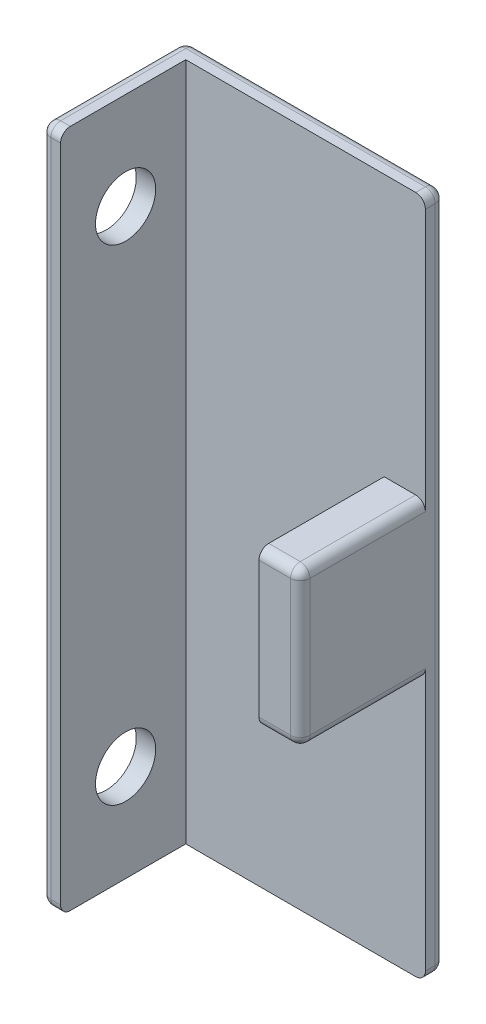
ISO-10303-21;
HEADER;
FILE_DESCRIPTION(('STEP AP214'),'2;1');
FILE_NAME('part.step','',(''),(''),'','','');
FILE_SCHEMA(('AUTOMOTIVE_DESIGN { 1 0 10303 214 1 1 1 1 }'));
ENDSEC;
DATA;
#1=APPLICATION_CONTEXT('core data for automotive mechanical design processes');
#2=APPLICATION_PROTOCOL_DEFINITION('international standard','automotive_design',2000,#1);
#3=PRODUCT_CONTEXT('',#1,'mechanical');
#4=PRODUCT('Part','Part','',(#3));
#5=PRODUCT_RELATED_PRODUCT_CATEGORY('part','',(#4));
#6=PRODUCT_DEFINITION_FORMATION('','',#4);
#7=PRODUCT_DEFINITION_CONTEXT('part definition',#1,'design');
#8=PRODUCT_DEFINITION('design','',#6,#7);
#9=PRODUCT_DEFINITION_SHAPE('','',#8);
#10=(LENGTH_UNIT() NAMED_UNIT(*) SI_UNIT(.MILLI.,.METRE.));
#11=(NAMED_UNIT(*) PLANE_ANGLE_UNIT() SI_UNIT($,.RADIAN.));
#12=(NAMED_UNIT(*) SI_UNIT($,.STERADIAN.) SOLID_ANGLE_UNIT());
#13=UNCERTAINTY_MEASURE_WITH_UNIT(LENGTH_MEASURE(1.E-05),#10,'distance_accuracy_value','');
#14=(GEOMETRIC_REPRESENTATION_CONTEXT(3) GLOBAL_UNCERTAINTY_ASSIGNED_CONTEXT((#13)) GLOBAL_UNIT_ASSIGNED_CONTEXT((#10,
#11,#12)) REPRESENTATION_CONTEXT('',''));
#15=CARTESIAN_POINT('',(0.,0.,0.));
#16=DIRECTION('',(0.,0.,1.));
#17=DIRECTION('',(1.,0.,0.));
#18=AXIS2_PLACEMENT_3D('',#15,#16,#17);
#19=CARTESIAN_POINT('',(0.,0.,2.));
#20=DIRECTION('',(0.,0.,-1.));
#21=DIRECTION('',(-1.,0.,0.));
#22=AXIS2_PLACEMENT_3D('',#19,#20,#21);
#23=PLANE('',#22);
#24=DIRECTION('',(0.,-1.,0.));
#25=VECTOR('',#24,1.);
#26=CARTESIAN_POINT('',(26.7,0.,2.));
#27=LINE('',#26,#25);
#28=CARTESIAN_POINT('',(26.7,28.,2.));
#29=VERTEX_POINT('',#28);
#30=CARTESIAN_POINT('',(26.7,1.,2.));
#31=VERTEX_POINT('',#30);
#32=EDGE_CURVE('E193',#29,#31,#27,.T.);
#33=ORIENTED_EDGE('',*,*,#32,.F.);
#34=CARTESIAN_POINT('',(25.7,28.,2.));
#35=DIRECTION('',(0.,0.,-1.));
#36=DIRECTION('',(-1.,0.,0.));
#37=AXIS2_PLACEMENT_3D('',#34,#35,#36);
#38=CIRCLE('',#37,1.);
#39=CARTESIAN_POINT('',(25.7,27.,2.));
#40=VERTEX_POINT('',#39);
#41=EDGE_CURVE('E189',#29,#40,#38,.T.);
#42=ORIENTED_EDGE('',*,*,#41,.T.);
#43=DIRECTION('',(-1.,0.,0.));
#44=VECTOR('',#43,1.);
#45=CARTESIAN_POINT('',(56.6234022129837,27.,2.));
#46=LINE('',#45,#44);
#47=CARTESIAN_POINT('',(22.45,27.,2.));
#48=VERTEX_POINT('',#47);
#49=EDGE_CURVE('E183',#40,#48,#46,.T.);
#50=ORIENTED_EDGE('',*,*,#49,.T.);
#51=DIRECTION('',(0.,-1.,0.));
#52=VECTOR('',#51,1.);
#53=CARTESIAN_POINT('',(22.45,43.,2.));
#54=LINE('',#53,#52);
#55=CARTESIAN_POINT('',(22.45,43.,2.));
#56=VERTEX_POINT('',#55);
#57=EDGE_CURVE('E187',#56,#48,#54,.T.);
#58=ORIENTED_EDGE('',*,*,#57,.F.);
#59=DIRECTION('',(-1.,0.,0.));
#60=VECTOR('',#59,1.);
#61=CARTESIAN_POINT('',(56.6234022129837,43.,2.));
#62=LINE('',#61,#60);
#63=CARTESIAN_POINT('',(25.7,43.,2.));
#64=VERTEX_POINT('',#63);
#65=EDGE_CURVE('E192',#64,#56,#62,.T.);
#66=ORIENTED_EDGE('',*,*,#65,.F.);
#67=CARTESIAN_POINT('',(25.7,42.,2.));
#68=DIRECTION('',(0.,0.,-1.));
#69=DIRECTION('',(-1.,0.,0.));
#70=AXIS2_PLACEMENT_3D('',#67,#68,#69);
#71=CIRCLE('',#70,1.);
#72=CARTESIAN_POINT('',(26.7,42.,2.));
#73=VERTEX_POINT('',#72);
#74=EDGE_CURVE('E11',#64,#73,#71,.T.);
#75=ORIENTED_EDGE('',*,*,#74,.T.);
#76=DIRECTION('',(0.,1.,0.));
#77=VECTOR('',#76,1.);
#78=CARTESIAN_POINT('',(26.7,70.,2.));
#79=LINE('',#78,#77);
#80=CARTESIAN_POINT('',(26.7,69.,2.));
#81=VERTEX_POINT('',#80);
#82=EDGE_CURVE('E52',#73,#81,#79,.T.);
#83=ORIENTED_EDGE('',*,*,#82,.T.);
#84=CARTESIAN_POINT('',(25.7,69.,2.));
#85=DIRECTION('',(0.,0.,-1.));
#86=DIRECTION('',(0.,1.,0.));
#87=AXIS2_PLACEMENT_3D('',#84,#85,#86);
#88=CIRCLE('',#87,1.);
#89=CARTESIAN_POINT('',(25.7,70.,2.));
#90=VERTEX_POINT('',#89);
#91=EDGE_CURVE('E224',#81,#90,#88,.F.);
#92=ORIENTED_EDGE('',*,*,#91,.T.);
#93=DIRECTION('',(-1.,0.,0.));
#94=VECTOR('',#93,1.);
#95=CARTESIAN_POINT('',(0.,70.,2.));
#96=LINE('',#95,#94);
#97=CARTESIAN_POINT('',(2.,70.,2.));
#98=VERTEX_POINT('',#97);
#99=EDGE_CURVE('E251',#90,#98,#96,.T.);
#100=ORIENTED_EDGE('',*,*,#99,.T.);
#101=DIRECTION('',(0.,1.,0.));
#102=VECTOR('',#101,1.);
#103=CARTESIAN_POINT('',(2.,70.,2.));
#104=LINE('',#103,#102);
#105=CARTESIAN_POINT('',(2.,0.,2.));
#106=VERTEX_POINT('',#105);
#107=EDGE_CURVE('E239',#106,#98,#104,.T.);
#108=ORIENTED_EDGE('',*,*,#107,.F.);
#109=DIRECTION('',(1.,0.,0.));
#110=VECTOR('',#109,1.);
#111=CARTESIAN_POINT('',(0.,0.,2.));
#112=LINE('',#111,#110);
#113=CARTESIAN_POINT('',(25.7,0.,2.));
#114=VERTEX_POINT('',#113);
#115=EDGE_CURVE('E249',#106,#114,#112,.T.);
#116=ORIENTED_EDGE('',*,*,#115,.T.);
#117=CARTESIAN_POINT('',(25.7,1.,2.));
#118=DIRECTION('',(0.,0.,1.));
#119=DIRECTION('',(1.,0.,0.));
#120=AXIS2_PLACEMENT_3D('',#117,#118,#119);
#121=CIRCLE('',#120,1.);
#122=EDGE_CURVE('E218',#31,#114,#121,.F.);
#123=ORIENTED_EDGE('',*,*,#122,.F.);
#124=EDGE_LOOP('',(#33,#42,#50,#58,#66,#75,#83,#92,#100,#108,#116,#123));
#125=FACE_BOUND('',#124,.T.);
#126=ADVANCED_FACE('F35',(#125),#23,.F.);
#127=CARTESIAN_POINT('',(25.7,0.,13.9));
#128=DIRECTION('',(0.,-1.,0.));
#129=DIRECTION('',(0.,0.,-1.));
#130=AXIS2_PLACEMENT_3D('',#127,#128,#129);
#131=CYLINDRICAL_SURFACE('',#130,1.);
#132=DIRECTION('',(0.,-1.,0.));
#133=VECTOR('',#132,1.);
#134=CARTESIAN_POINT('',(26.7,0.,13.9));
#135=LINE('',#134,#133);
#136=CARTESIAN_POINT('',(26.7,42.,13.9));
#137=VERTEX_POINT('',#136);
#138=CARTESIAN_POINT('',(26.7,28.,13.9));
#139=VERTEX_POINT('',#138);
#140=EDGE_CURVE('E367',#137,#139,#135,.T.);
#141=ORIENTED_EDGE('',*,*,#140,.F.);
#142=CARTESIAN_POINT('',(25.7,42.,13.9));
#143=DIRECTION('',(0.,-1.,0.));
#144=DIRECTION('',(0.,0.,-1.));
#145=AXIS2_PLACEMENT_3D('',#142,#143,#144);
#146=CIRCLE('',#145,1.);
#147=CARTESIAN_POINT('',(25.7,42.,14.9));
#148=VERTEX_POINT('',#147);
#149=EDGE_CURVE('E394',#137,#148,#146,.T.);
#150=ORIENTED_EDGE('',*,*,#149,.T.);
#151=DIRECTION('',(0.,-1.,0.));
#152=VECTOR('',#151,1.);
#153=CARTESIAN_POINT('',(25.7,0.,14.9));
#154=LINE('',#153,#152);
#155=CARTESIAN_POINT('',(25.7,28.,14.9));
#156=VERTEX_POINT('',#155);
#157=EDGE_CURVE('E364',#156,#148,#154,.F.);
#158=ORIENTED_EDGE('',*,*,#157,.F.);
#159=CARTESIAN_POINT('',(25.7,28.,13.9));
#160=DIRECTION('',(0.,-1.,0.));
#161=DIRECTION('',(0.,0.,-1.));
#162=AXIS2_PLACEMENT_3D('',#159,#160,#161);
#163=CIRCLE('',#162,1.);
#164=EDGE_CURVE('E376',#156,#139,#163,.F.);
#165=ORIENTED_EDGE('',*,*,#164,.T.);
#166=EDGE_LOOP('',(#141,#150,#158,#165));
#167=FACE_BOUND('',#166,.T.);
#168=ADVANCED_FACE('F497',(#167),#131,.T.);
#169=CARTESIAN_POINT('',(25.7,1.,2.));
#170=DIRECTION('',(0.,0.,1.));
#171=DIRECTION('',(1.,0.,0.));
#172=AXIS2_PLACEMENT_3D('',#169,#170,#171);
#173=CYLINDRICAL_SURFACE('',#172,1.);
#174=DIRECTION('',(0.,0.,1.));
#175=VECTOR('',#174,1.);
#176=CARTESIAN_POINT('',(26.7,1.,2.));
#177=LINE('',#176,#175);
#178=CARTESIAN_POINT('',(26.7,1.,1.));
#179=VERTEX_POINT('',#178);
#180=EDGE_CURVE('E316',#31,#179,#177,.F.);
#181=ORIENTED_EDGE('',*,*,#180,.F.);
#182=ORIENTED_EDGE('',*,*,#122,.T.);
#183=DIRECTION('',(0.,0.,1.));
#184=VECTOR('',#183,1.);
#185=CARTESIAN_POINT('',(25.7,0.,2.));
#186=LINE('',#185,#184);
#187=CARTESIAN_POINT('',(25.7,0.,1.));
#188=VERTEX_POINT('',#187);
#189=EDGE_CURVE('E296',#188,#114,#186,.T.);
#190=ORIENTED_EDGE('',*,*,#189,.F.);
#191=CARTESIAN_POINT('',(25.7,1.,1.));
#192=DIRECTION('',(0.,0.,1.));
#193=DIRECTION('',(1.,0.,0.));
#194=AXIS2_PLACEMENT_3D('',#191,#192,#193);
#195=CIRCLE('',#194,1.);
#196=EDGE_CURVE('E324',#188,#179,#195,.T.);
#197=ORIENTED_EDGE('',*,*,#196,.T.);
#198=EDGE_LOOP('',(#181,#182,#190,#197));
#199=FACE_BOUND('',#198,.T.);
#200=ADVANCED_FACE('F501',(#199),#173,.T.);
#201=CARTESIAN_POINT('',(0.,0.,2.));
#202=DIRECTION('',(0.,1.,0.));
#203=DIRECTION('',(0.,0.,1.));
#204=AXIS2_PLACEMENT_3D('',#201,#202,#203);
#205=PLANE('',#204);
#206=ORIENTED_EDGE('',*,*,#189,.T.);
#207=ORIENTED_EDGE('',*,*,#115,.F.);
#208=DIRECTION('',(0.,0.,-1.));
#209=VECTOR('',#208,1.);
#210=CARTESIAN_POINT('',(2.00000000000001,0.,14.9));
#211=LINE('',#210,#209);
#212=CARTESIAN_POINT('',(2.00000000000001,0.,13.9));
#213=VERTEX_POINT('',#212);
#214=EDGE_CURVE('E247',#213,#106,#211,.T.);
#215=ORIENTED_EDGE('',*,*,#214,.F.);
#216=DIRECTION('',(-1.,0.,0.));
#217=VECTOR('',#216,1.);
#218=CARTESIAN_POINT('',(0.,0.,13.9));
#219=LINE('',#218,#217);
#220=CARTESIAN_POINT('',(1.,0.,13.9));
#221=VERTEX_POINT('',#220);
#222=EDGE_CURVE('E327',#213,#221,#219,.T.);
#223=ORIENTED_EDGE('',*,*,#222,.T.);
#224=DIRECTION('',(0.,0.,-1.));
#225=VECTOR('',#224,1.);
#226=CARTESIAN_POINT('',(1.,0.,2.));
#227=LINE('',#226,#225);
#228=CARTESIAN_POINT('',(1.,0.,1.));
#229=VERTEX_POINT('',#228);
#230=EDGE_CURVE('E302',#221,#229,#227,.T.);
#231=ORIENTED_EDGE('',*,*,#230,.T.);
#232=DIRECTION('',(1.,0.,0.));
#233=VECTOR('',#232,1.);
#234=CARTESIAN_POINT('',(0.,0.,1.));
#235=LINE('',#234,#233);
#236=EDGE_CURVE('E299',#229,#188,#235,.T.);
#237=ORIENTED_EDGE('',*,*,#236,.T.);
#238=EDGE_LOOP('',(#206,#207,#215,#223,#231,#237));
#239=FACE_BOUND('',#238,.T.);
#240=ADVANCED_FACE('F465',(#239),#205,.F.);
#241=CARTESIAN_POINT('',(26.7,0.,2.));
#242=DIRECTION('',(-1.,0.,0.));
#243=DIRECTION('',(0.,0.,1.));
#244=AXIS2_PLACEMENT_3D('',#241,#242,#243);
#245=PLANE('',#244);
#246=ORIENTED_EDGE('',*,*,#82,.F.);
#247=DIRECTION('',(0.,0.,-1.));
#248=VECTOR('',#247,1.);
#249=CARTESIAN_POINT('',(26.7,42.,2.));
#250=LINE('',#249,#248);
#251=EDGE_CURVE('E44',#73,#137,#250,.F.);
#252=ORIENTED_EDGE('',*,*,#251,.T.);
#253=ORIENTED_EDGE('',*,*,#140,.T.);
#254=DIRECTION('',(0.,0.,-1.));
#255=VECTOR('',#254,1.);
#256=CARTESIAN_POINT('',(26.7,28.,2.));
#257=LINE('',#256,#255);
#258=EDGE_CURVE('E379',#139,#29,#257,.T.);
#259=ORIENTED_EDGE('',*,*,#258,.T.);
#260=ORIENTED_EDGE('',*,*,#32,.T.);
#261=ORIENTED_EDGE('',*,*,#180,.T.);
#262=DIRECTION('',(0.,-1.,0.));
#263=VECTOR('',#262,1.);
#264=CARTESIAN_POINT('',(26.7,0.,1.));
#265=LINE('',#264,#263);
#266=CARTESIAN_POINT('',(26.7,69.,1.));
#267=VERTEX_POINT('',#266);
#268=EDGE_CURVE('E280',#179,#267,#265,.F.);
#269=ORIENTED_EDGE('',*,*,#268,.T.);
#270=DIRECTION('',(0.,0.,-1.));
#271=VECTOR('',#270,1.);
#272=CARTESIAN_POINT('',(26.7,69.,2.));
#273=LINE('',#272,#271);
#274=EDGE_CURVE('E282',#267,#81,#273,.F.);
#275=ORIENTED_EDGE('',*,*,#274,.T.);
#276=EDGE_LOOP('',(#246,#252,#253,#259,#260,#261,#269,#275));
#277=FACE_BOUND('',#276,.T.);
#278=ADVANCED_FACE('F418',(#277),#245,.F.);
#279=CARTESIAN_POINT('',(0.,0.,14.9));
#280=DIRECTION('',(0.,0.,-1.));
#281=DIRECTION('',(-1.,0.,0.));
#282=AXIS2_PLACEMENT_3D('',#279,#280,#281);
#283=PLANE('',#282);
#284=ORIENTED_EDGE('',*,*,#157,.T.);
#285=DIRECTION('',(-1.,0.,0.));
#286=VECTOR('',#285,1.);
#287=CARTESIAN_POINT('',(0.,42.,14.9));
#288=LINE('',#287,#286);
#289=CARTESIAN_POINT('',(22.45,42.,14.9));
#290=VERTEX_POINT('',#289);
#291=EDGE_CURVE('E383',#148,#290,#288,.T.);
#292=ORIENTED_EDGE('',*,*,#291,.T.);
#293=DIRECTION('',(0.,1.,0.));
#294=VECTOR('',#293,1.);
#295=CARTESIAN_POINT('',(22.45,43.,14.9));
#296=LINE('',#295,#294);
#297=CARTESIAN_POINT('',(22.45,28.,14.9));
#298=VERTEX_POINT('',#297);
#299=EDGE_CURVE('E202',#298,#290,#296,.T.);
#300=ORIENTED_EDGE('',*,*,#299,.F.);
#301=DIRECTION('',(-1.,0.,0.));
#302=VECTOR('',#301,1.);
#303=CARTESIAN_POINT('',(25.7,28.,14.9));
#304=LINE('',#303,#302);
#305=EDGE_CURVE('E374',#298,#156,#304,.F.);
#306=ORIENTED_EDGE('',*,*,#305,.T.);
#307=EDGE_LOOP('',(#284,#292,#300,#306));
#308=FACE_BOUND('',#307,.T.);
#309=ADVANCED_FACE('F509',(#308),#283,.F.);
#310=CARTESIAN_POINT('',(1.,69.,13.9));
#311=DIRECTION('',(0.,0.,1.));
#312=DIRECTION('',(1.,0.,0.));
#313=AXIS2_PLACEMENT_3D('',#310,#311,#312);
#314=SPHERICAL_SURFACE('',#313,1.);
#315=CARTESIAN_POINT('',(1.,69.,13.9));
#316=DIRECTION('',(1.,0.,0.));
#317=DIRECTION('',(0.,0.,-1.));
#318=AXIS2_PLACEMENT_3D('',#315,#316,#317);
#319=CIRCLE('',#318,1.);
#320=CARTESIAN_POINT('',(1.,70.,13.9));
#321=VERTEX_POINT('',#320);
#322=CARTESIAN_POINT('',(1.,69.,14.9));
#323=VERTEX_POINT('',#322);
#324=EDGE_CURVE('E362',#321,#323,#319,.T.);
#325=ORIENTED_EDGE('',*,*,#324,.F.);
#326=CARTESIAN_POINT('',(1.,69.,13.9));
#327=DIRECTION('',(0.,0.,1.));
#328=DIRECTION('',(1.,0.,0.));
#329=AXIS2_PLACEMENT_3D('',#326,#327,#328);
#330=CIRCLE('',#329,1.);
#331=CARTESIAN_POINT('',(0.,69.,13.9));
#332=VERTEX_POINT('',#331);
#333=EDGE_CURVE('E349',#332,#321,#330,.F.);
#334=ORIENTED_EDGE('',*,*,#333,.F.);
#335=CARTESIAN_POINT('',(1.,69.,13.9));
#336=DIRECTION('',(0.,1.,0.));
#337=DIRECTION('',(0.,0.,1.));
#338=AXIS2_PLACEMENT_3D('',#335,#336,#337);
#339=CIRCLE('',#338,1.);
#340=EDGE_CURVE('E359',#332,#323,#339,.T.);
#341=ORIENTED_EDGE('',*,*,#340,.T.);
#342=EDGE_LOOP('',(#325,#334,#341));
#343=FACE_BOUND('',#342,.T.);
#344=ADVANCED_FACE('F445',(#343),#314,.T.);
#345=CARTESIAN_POINT('',(1.,0.,13.9));
#346=DIRECTION('',(0.,-1.,0.));
#347=DIRECTION('',(0.,0.,-1.));
#348=AXIS2_PLACEMENT_3D('',#345,#346,#347);
#349=CYLINDRICAL_SURFACE('',#348,1.);
#350=ORIENTED_EDGE('',*,*,#340,.F.);
#351=DIRECTION('',(0.,1.,0.));
#352=VECTOR('',#351,1.);
#353=CARTESIAN_POINT('',(0.,0.,13.9));
#354=LINE('',#353,#352);
#355=CARTESIAN_POINT('',(0.,1.,13.9));
#356=VERTEX_POINT('',#355);
#357=EDGE_CURVE('E346',#356,#332,#354,.T.);
#358=ORIENTED_EDGE('',*,*,#357,.F.);
#359=CARTESIAN_POINT('',(1.,1.,13.9));
#360=DIRECTION('',(0.,1.,0.));
#361=DIRECTION('',(0.,0.,1.));
#362=AXIS2_PLACEMENT_3D('',#359,#360,#361);
#363=CIRCLE('',#362,1.);
#364=CARTESIAN_POINT('',(1.,1.,14.9));
#365=VERTEX_POINT('',#364);
#366=EDGE_CURVE('E357',#356,#365,#363,.T.);
#367=ORIENTED_EDGE('',*,*,#366,.T.);
#368=DIRECTION('',(0.,1.,0.));
#369=VECTOR('',#368,1.);
#370=CARTESIAN_POINT('',(1.,0.,14.9));
#371=LINE('',#370,#369);
#372=EDGE_CURVE('E333',#323,#365,#371,.F.);
#373=ORIENTED_EDGE('',*,*,#372,.F.);
#374=EDGE_LOOP('',(#350,#358,#367,#373));
#375=FACE_BOUND('',#374,.T.);
#376=ADVANCED_FACE('F453',(#375),#349,.T.);
#377=CARTESIAN_POINT('',(1.,1.,13.9));
#378=DIRECTION('',(0.,0.,1.));
#379=DIRECTION('',(1.,0.,0.));
#380=AXIS2_PLACEMENT_3D('',#377,#378,#379);
#381=SPHERICAL_SURFACE('',#380,1.);
#382=ORIENTED_EDGE('',*,*,#366,.F.);
#383=CARTESIAN_POINT('',(1.,1.,13.9));
#384=DIRECTION('',(0.,0.,-1.));
#385=DIRECTION('',(-1.,0.,0.));
#386=AXIS2_PLACEMENT_3D('',#383,#384,#385);
#387=CIRCLE('',#386,1.);
#388=EDGE_CURVE('E343',#221,#356,#387,.T.);
#389=ORIENTED_EDGE('',*,*,#388,.F.);
#390=CARTESIAN_POINT('',(1.,1.,13.9));
#391=DIRECTION('',(-1.,0.,0.));
#392=DIRECTION('',(0.,0.,1.));
#393=AXIS2_PLACEMENT_3D('',#390,#391,#392);
#394=CIRCLE('',#393,1.);
#395=EDGE_CURVE('E354',#221,#365,#394,.T.);
#396=ORIENTED_EDGE('',*,*,#395,.T.);
#397=EDGE_LOOP('',(#382,#389,#396));
#398=FACE_BOUND('',#397,.T.);
#399=ADVANCED_FACE('F460',(#398),#381,.T.);
#400=CARTESIAN_POINT('',(0.,1.,13.9));
#401=DIRECTION('',(1.,0.,0.));
#402=DIRECTION('',(0.,0.,-1.));
#403=AXIS2_PLACEMENT_3D('',#400,#401,#402);
#404=CYLINDRICAL_SURFACE('',#403,1.);
#405=ORIENTED_EDGE('',*,*,#395,.F.);
#406=ORIENTED_EDGE('',*,*,#222,.F.);
#407=CARTESIAN_POINT('',(2.00000000000001,1.,13.9));
#408=DIRECTION('',(-1.,0.,0.));
#409=DIRECTION('',(0.,-1.,0.));
#410=AXIS2_PLACEMENT_3D('',#407,#408,#409);
#411=CIRCLE('',#410,1.);
#412=CARTESIAN_POINT('',(2.00000000000001,1.,14.9));
#413=VERTEX_POINT('',#412);
#414=EDGE_CURVE('E341',#413,#213,#411,.F.);
#415=ORIENTED_EDGE('',*,*,#414,.F.);
#416=DIRECTION('',(-1.,0.,0.));
#417=VECTOR('',#416,1.);
#418=CARTESIAN_POINT('',(0.,1.,14.9));
#419=LINE('',#418,#417);
#420=EDGE_CURVE('E336',#365,#413,#419,.F.);
#421=ORIENTED_EDGE('',*,*,#420,.F.);
#422=EDGE_LOOP('',(#405,#406,#415,#421));
#423=FACE_BOUND('',#422,.T.);
#424=ADVANCED_FACE('F469',(#423),#404,.T.);
#425=CARTESIAN_POINT('',(0.,69.,13.9));
#426=DIRECTION('',(-1.,0.,0.));
#427=DIRECTION('',(0.,0.,1.));
#428=AXIS2_PLACEMENT_3D('',#425,#426,#427);
#429=CYLINDRICAL_SURFACE('',#428,1.);
#430=DIRECTION('',(1.,0.,0.));
#431=VECTOR('',#430,1.);
#432=CARTESIAN_POINT('',(0.,70.,13.9));
#433=LINE('',#432,#431);
#434=CARTESIAN_POINT('',(2.,70.,13.9));
#435=VERTEX_POINT('',#434);
#436=EDGE_CURVE('E352',#321,#435,#433,.T.);
#437=ORIENTED_EDGE('',*,*,#436,.F.);
#438=ORIENTED_EDGE('',*,*,#324,.T.);
#439=DIRECTION('',(1.,0.,0.));
#440=VECTOR('',#439,1.);
#441=CARTESIAN_POINT('',(0.,69.,14.9));
#442=LINE('',#441,#440);
#443=CARTESIAN_POINT('',(2.,69.,14.9));
#444=VERTEX_POINT('',#443);
#445=EDGE_CURVE('E330',#444,#323,#442,.F.);
#446=ORIENTED_EDGE('',*,*,#445,.F.);
#447=CARTESIAN_POINT('',(2.,69.,13.9));
#448=DIRECTION('',(-1.,0.,0.));
#449=DIRECTION('',(0.,-1.,0.));
#450=AXIS2_PLACEMENT_3D('',#447,#448,#449);
#451=CIRCLE('',#450,1.);
#452=EDGE_CURVE('E339',#435,#444,#451,.F.);
#453=ORIENTED_EDGE('',*,*,#452,.F.);
#454=EDGE_LOOP('',(#437,#438,#446,#453));
#455=FACE_BOUND('',#454,.T.);
#456=ADVANCED_FACE('F476',(#455),#429,.T.);
#457=CARTESIAN_POINT('',(25.7,1.,1.));
#458=DIRECTION('',(0.,1.,0.));
#459=DIRECTION('',(0.,0.,1.));
#460=AXIS2_PLACEMENT_3D('',#457,#458,#459);
#461=SPHERICAL_SURFACE('',#460,1.);
#462=ORIENTED_EDGE('',*,*,#196,.F.);
#463=CARTESIAN_POINT('',(25.7,1.,1.));
#464=DIRECTION('',(1.,0.,0.));
#465=DIRECTION('',(0.,0.,-1.));
#466=AXIS2_PLACEMENT_3D('',#463,#464,#465);
#467=CIRCLE('',#466,1.);
#468=CARTESIAN_POINT('',(25.7,1.,0.));
#469=VERTEX_POINT('',#468);
#470=EDGE_CURVE('E322',#188,#469,#467,.T.);
#471=ORIENTED_EDGE('',*,*,#470,.T.);
#472=CARTESIAN_POINT('',(25.7,1.,1.));
#473=DIRECTION('',(0.,1.,0.));
#474=DIRECTION('',(0.,0.,1.));
#475=AXIS2_PLACEMENT_3D('',#472,#473,#474);
#476=CIRCLE('',#475,1.);
#477=EDGE_CURVE('E313',#179,#469,#476,.T.);
#478=ORIENTED_EDGE('',*,*,#477,.F.);
#479=EDGE_LOOP('',(#462,#471,#478));
#480=FACE_BOUND('',#479,.T.);
#481=ADVANCED_FACE('F540',(#480),#461,.T.);
#482=CARTESIAN_POINT('',(0.,1.,1.));
#483=DIRECTION('',(-1.,0.,0.));
#484=DIRECTION('',(0.,0.,1.));
#485=AXIS2_PLACEMENT_3D('',#482,#483,#484);
#486=CYLINDRICAL_SURFACE('',#485,1.);
#487=ORIENTED_EDGE('',*,*,#470,.F.);
#488=ORIENTED_EDGE('',*,*,#236,.F.);
#489=CARTESIAN_POINT('',(1.,1.,1.));
#490=DIRECTION('',(1.,0.,0.));
#491=DIRECTION('',(0.,0.,-1.));
#492=AXIS2_PLACEMENT_3D('',#489,#490,#491);
#493=CIRCLE('',#492,1.);
#494=CARTESIAN_POINT('',(1.,1.,0.));
#495=VERTEX_POINT('',#494);
#496=EDGE_CURVE('E320',#229,#495,#493,.T.);
#497=ORIENTED_EDGE('',*,*,#496,.T.);
#498=DIRECTION('',(1.,0.,0.));
#499=VECTOR('',#498,1.);
#500=CARTESIAN_POINT('',(0.,1.,0.));
#501=LINE('',#500,#499);
#502=EDGE_CURVE('E310',#469,#495,#501,.F.);
#503=ORIENTED_EDGE('',*,*,#502,.F.);
#504=EDGE_LOOP('',(#487,#488,#497,#503));
#505=FACE_BOUND('',#504,.T.);
#506=ADVANCED_FACE('F536',(#505),#486,.T.);
#507=CARTESIAN_POINT('',(1.,1.,1.));
#508=DIRECTION('',(0.,1.,0.));
#509=DIRECTION('',(0.,0.,1.));
#510=AXIS2_PLACEMENT_3D('',#507,#508,#509);
#511=SPHERICAL_SURFACE('',#510,1.);
#512=ORIENTED_EDGE('',*,*,#496,.F.);
#513=CARTESIAN_POINT('',(1.,1.,1.));
#514=DIRECTION('',(0.,0.,-1.));
#515=DIRECTION('',(-1.,0.,0.));
#516=AXIS2_PLACEMENT_3D('',#513,#514,#515);
#517=CIRCLE('',#516,1.);
#518=CARTESIAN_POINT('',(0.,1.,1.));
#519=VERTEX_POINT('',#518);
#520=EDGE_CURVE('E318',#229,#519,#517,.T.);
#521=ORIENTED_EDGE('',*,*,#520,.T.);
#522=CARTESIAN_POINT('',(1.,1.,1.));
#523=DIRECTION('',(0.,-1.,0.));
#524=DIRECTION('',(0.,0.,-1.));
#525=AXIS2_PLACEMENT_3D('',#522,#523,#524);
#526=CIRCLE('',#525,1.);
#527=EDGE_CURVE('E307',#495,#519,#526,.F.);
#528=ORIENTED_EDGE('',*,*,#527,.F.);
#529=EDGE_LOOP('',(#512,#521,#528));
#530=FACE_BOUND('',#529,.T.);
#531=ADVANCED_FACE('F533',(#530),#511,.T.);
#532=CARTESIAN_POINT('',(1.,1.,2.));
#533=DIRECTION('',(0.,0.,-1.));
#534=DIRECTION('',(-1.,0.,0.));
#535=AXIS2_PLACEMENT_3D('',#532,#533,#534);
#536=CYLINDRICAL_SURFACE('',#535,1.);
#537=ORIENTED_EDGE('',*,*,#230,.F.);
#538=ORIENTED_EDGE('',*,*,#388,.T.);
#539=DIRECTION('',(0.,0.,-1.));
#540=VECTOR('',#539,1.);
#541=CARTESIAN_POINT('',(0.,1.,2.));
#542=LINE('',#541,#540);
#543=EDGE_CURVE('E304',#519,#356,#542,.F.);
#544=ORIENTED_EDGE('',*,*,#543,.F.);
#545=ORIENTED_EDGE('',*,*,#520,.F.);
#546=EDGE_LOOP('',(#537,#538,#544,#545));
#547=FACE_BOUND('',#546,.T.);
#548=ADVANCED_FACE('F457',(#547),#536,.T.);
#549=CARTESIAN_POINT('',(25.7,69.,1.));
#550=DIRECTION('',(-1.,0.,0.));
#551=DIRECTION('',(0.,0.,1.));
#552=AXIS2_PLACEMENT_3D('',#549,#550,#551);
#553=SPHERICAL_SURFACE('',#552,1.);
#554=CARTESIAN_POINT('',(25.7,69.,1.));
#555=DIRECTION('',(0.,-1.,0.));
#556=DIRECTION('',(0.,0.,-1.));
#557=AXIS2_PLACEMENT_3D('',#554,#555,#556);
#558=CIRCLE('',#557,1.);
#559=CARTESIAN_POINT('',(25.7,69.,0.));
#560=VERTEX_POINT('',#559);
#561=EDGE_CURVE('E293',#560,#267,#558,.T.);
#562=ORIENTED_EDGE('',*,*,#561,.F.);
#563=CARTESIAN_POINT('',(25.7,69.,1.));
#564=DIRECTION('',(1.,0.,0.));
#565=DIRECTION('',(0.,0.,-1.));
#566=AXIS2_PLACEMENT_3D('',#563,#564,#565);
#567=CIRCLE('',#566,1.);
#568=CARTESIAN_POINT('',(25.7,70.,1.));
#569=VERTEX_POINT('',#568);
#570=EDGE_CURVE('E284',#569,#560,#567,.F.);
#571=ORIENTED_EDGE('',*,*,#570,.F.);
#572=CARTESIAN_POINT('',(25.7,69.,1.));
#573=DIRECTION('',(0.,0.,-1.));
#574=DIRECTION('',(-1.,0.,0.));
#575=AXIS2_PLACEMENT_3D('',#572,#573,#574);
#576=CIRCLE('',#575,1.);
#577=EDGE_CURVE('E290',#569,#267,#576,.T.);
#578=ORIENTED_EDGE('',*,*,#577,.T.);
#579=EDGE_LOOP('',(#562,#571,#578));
#580=FACE_BOUND('',#579,.T.);
#581=ADVANCED_FACE('F426',(#580),#553,.T.);
#582=CARTESIAN_POINT('',(25.7,69.,2.));
#583=DIRECTION('',(0.,0.,-1.));
#584=DIRECTION('',(-1.,0.,0.));
#585=AXIS2_PLACEMENT_3D('',#582,#583,#584);
#586=CYLINDRICAL_SURFACE('',#585,1.);
#587=ORIENTED_EDGE('',*,*,#91,.F.);
#588=ORIENTED_EDGE('',*,*,#274,.F.);
#589=ORIENTED_EDGE('',*,*,#577,.F.);
#590=DIRECTION('',(0.,0.,-1.));
#591=VECTOR('',#590,1.);
#592=CARTESIAN_POINT('',(25.7,70.,2.));
#593=LINE('',#592,#591);
#594=EDGE_CURVE('E278',#90,#569,#593,.T.);
#595=ORIENTED_EDGE('',*,*,#594,.F.);
#596=EDGE_LOOP('',(#587,#588,#589,#595));
#597=FACE_BOUND('',#596,.T.);
#598=ADVANCED_FACE('F416',(#597),#586,.T.);
#599=CARTESIAN_POINT('',(25.7,0.,1.));
#600=DIRECTION('',(0.,1.,0.));
#601=DIRECTION('',(0.,0.,1.));
#602=AXIS2_PLACEMENT_3D('',#599,#600,#601);
#603=CYLINDRICAL_SURFACE('',#602,1.);
#604=ORIENTED_EDGE('',*,*,#268,.F.);
#605=ORIENTED_EDGE('',*,*,#477,.T.);
#606=DIRECTION('',(0.,-1.,0.));
#607=VECTOR('',#606,1.);
#608=CARTESIAN_POINT('',(25.7,0.,0.));
#609=LINE('',#608,#607);
#610=EDGE_CURVE('E287',#560,#469,#609,.T.);
#611=ORIENTED_EDGE('',*,*,#610,.F.);
#612=ORIENTED_EDGE('',*,*,#561,.T.);
#613=EDGE_LOOP('',(#604,#605,#611,#612));
#614=FACE_BOUND('',#613,.T.);
#615=ADVANCED_FACE('F423',(#614),#603,.T.);
#616=CARTESIAN_POINT('',(1.,69.,1.));
#617=DIRECTION('',(1.,0.,0.));
#618=DIRECTION('',(0.,0.,-1.));
#619=AXIS2_PLACEMENT_3D('',#616,#617,#618);
#620=SPHERICAL_SURFACE('',#619,1.);
#621=CARTESIAN_POINT('',(1.,69.,1.));
#622=DIRECTION('',(0.,0.,1.));
#623=DIRECTION('',(1.,0.,0.));
#624=AXIS2_PLACEMENT_3D('',#621,#622,#623);
#625=CIRCLE('',#624,1.);
#626=CARTESIAN_POINT('',(1.,70.,1.));
#627=VERTEX_POINT('',#626);
#628=CARTESIAN_POINT('',(0.,69.,1.));
#629=VERTEX_POINT('',#628);
#630=EDGE_CURVE('E275',#627,#629,#625,.T.);
#631=ORIENTED_EDGE('',*,*,#630,.F.);
#632=CARTESIAN_POINT('',(1.,69.,1.));
#633=DIRECTION('',(1.,0.,0.));
#634=DIRECTION('',(0.,0.,-1.));
#635=AXIS2_PLACEMENT_3D('',#632,#633,#634);
#636=CIRCLE('',#635,1.);
#637=CARTESIAN_POINT('',(1.,69.,0.));
#638=VERTEX_POINT('',#637);
#639=EDGE_CURVE('E266',#638,#627,#636,.T.);
#640=ORIENTED_EDGE('',*,*,#639,.F.);
#641=CARTESIAN_POINT('',(1.,69.,1.));
#642=DIRECTION('',(0.,1.,0.));
#643=DIRECTION('',(0.,0.,1.));
#644=AXIS2_PLACEMENT_3D('',#641,#642,#643);
#645=CIRCLE('',#644,1.);
#646=EDGE_CURVE('E272',#638,#629,#645,.T.);
#647=ORIENTED_EDGE('',*,*,#646,.T.);
#648=EDGE_LOOP('',(#631,#640,#647));
#649=FACE_BOUND('',#648,.T.);
#650=ADVANCED_FACE('F437',(#649),#620,.T.);
#651=CARTESIAN_POINT('',(1.,0.,1.));
#652=DIRECTION('',(0.,-1.,0.));
#653=DIRECTION('',(0.,0.,-1.));
#654=AXIS2_PLACEMENT_3D('',#651,#652,#653);
#655=CYLINDRICAL_SURFACE('',#654,1.);
#656=DIRECTION('',(0.,1.,0.));
#657=VECTOR('',#656,1.);
#658=CARTESIAN_POINT('',(1.,0.,0.));
#659=LINE('',#658,#657);
#660=EDGE_CURVE('E259',#495,#638,#659,.T.);
#661=ORIENTED_EDGE('',*,*,#660,.F.);
#662=ORIENTED_EDGE('',*,*,#527,.T.);
#663=DIRECTION('',(0.,1.,0.));
#664=VECTOR('',#663,1.);
#665=CARTESIAN_POINT('',(0.,0.,1.));
#666=LINE('',#665,#664);
#667=EDGE_CURVE('E263',#629,#519,#666,.F.);
#668=ORIENTED_EDGE('',*,*,#667,.F.);
#669=ORIENTED_EDGE('',*,*,#646,.F.);
#670=EDGE_LOOP('',(#661,#662,#668,#669));
#671=FACE_BOUND('',#670,.T.);
#672=ADVANCED_FACE('F517',(#671),#655,.T.);
#673=CARTESIAN_POINT('',(1.,69.,2.));
#674=DIRECTION('',(0.,0.,1.));
#675=DIRECTION('',(1.,0.,0.));
#676=AXIS2_PLACEMENT_3D('',#673,#674,#675);
#677=CYLINDRICAL_SURFACE('',#676,1.);
#678=DIRECTION('',(0.,0.,1.));
#679=VECTOR('',#678,1.);
#680=CARTESIAN_POINT('',(0.,69.,2.));
#681=LINE('',#680,#679);
#682=EDGE_CURVE('E261',#332,#629,#681,.F.);
#683=ORIENTED_EDGE('',*,*,#682,.F.);
#684=ORIENTED_EDGE('',*,*,#333,.T.);
#685=DIRECTION('',(0.,0.,1.));
#686=VECTOR('',#685,1.);
#687=CARTESIAN_POINT('',(1.,70.,2.));
#688=LINE('',#687,#686);
#689=EDGE_CURVE('E269',#627,#321,#688,.T.);
#690=ORIENTED_EDGE('',*,*,#689,.F.);
#691=ORIENTED_EDGE('',*,*,#630,.T.);
#692=EDGE_LOOP('',(#683,#684,#690,#691));
#693=FACE_BOUND('',#692,.T.);
#694=ADVANCED_FACE('F442',(#693),#677,.T.);
#695=CARTESIAN_POINT('',(0.,69.,1.));
#696=DIRECTION('',(1.,0.,0.));
#697=DIRECTION('',(0.,0.,-1.));
#698=AXIS2_PLACEMENT_3D('',#695,#696,#697);
#699=CYLINDRICAL_SURFACE('',#698,1.);
#700=DIRECTION('',(-1.,0.,0.));
#701=VECTOR('',#700,1.);
#702=CARTESIAN_POINT('',(0.,70.,1.));
#703=LINE('',#702,#701);
#704=EDGE_CURVE('E254',#569,#627,#703,.T.);
#705=ORIENTED_EDGE('',*,*,#704,.F.);
#706=ORIENTED_EDGE('',*,*,#570,.T.);
#707=DIRECTION('',(-1.,0.,0.));
#708=VECTOR('',#707,1.);
#709=CARTESIAN_POINT('',(0.,69.,0.));
#710=LINE('',#709,#708);
#711=EDGE_CURVE('E256',#638,#560,#710,.F.);
#712=ORIENTED_EDGE('',*,*,#711,.F.);
#713=ORIENTED_EDGE('',*,*,#639,.T.);
#714=EDGE_LOOP('',(#705,#706,#712,#713));
#715=FACE_BOUND('',#714,.T.);
#716=ADVANCED_FACE('F430',(#715),#699,.T.);
#717=CARTESIAN_POINT('',(0.,0.,2.));
#718=DIRECTION('',(1.,0.,0.));
#719=DIRECTION('',(0.,0.,-1.));
#720=AXIS2_PLACEMENT_3D('',#717,#718,#719);
#721=PLANE('',#720);
#722=CARTESIAN_POINT('',(0.,60.,8.2));
#723=DIRECTION('',(1.,0.,0.));
#724=DIRECTION('',(0.,0.,1.));
#725=AXIS2_PLACEMENT_3D('',#722,#723,#724);
#726=CIRCLE('',#725,3.1);
#727=CARTESIAN_POINT('',(0.,60.,11.3));
#728=VERTEX_POINT('',#727);
#729=EDGE_CURVE('E227',#728,#728,#726,.T.);
#730=ORIENTED_EDGE('',*,*,#729,.T.);
#731=EDGE_LOOP('',(#730));
#732=FACE_BOUND('',#731,.T.);
#733=CARTESIAN_POINT('',(0.,10.,8.2));
#734=DIRECTION('',(-1.,0.,0.));
#735=DIRECTION('',(0.,0.,1.));
#736=AXIS2_PLACEMENT_3D('',#733,#734,#735);
#737=CIRCLE('',#736,3.1);
#738=CARTESIAN_POINT('',(0.,10.,11.3));
#739=VERTEX_POINT('',#738);
#740=EDGE_CURVE('E233',#739,#739,#737,.T.);
#741=ORIENTED_EDGE('',*,*,#740,.F.);
#742=EDGE_LOOP('',(#741));
#743=FACE_BOUND('',#742,.T.);
#744=ORIENTED_EDGE('',*,*,#543,.T.);
#745=ORIENTED_EDGE('',*,*,#357,.T.);
#746=ORIENTED_EDGE('',*,*,#682,.T.);
#747=ORIENTED_EDGE('',*,*,#667,.T.);
#748=EDGE_LOOP('',(#744,#745,#746,#747));
#749=FACE_BOUND('',#748,.T.);
#750=ADVANCED_FACE('F450',(#732,#743,#749),#721,.F.);
#751=CARTESIAN_POINT('',(0.,70.,2.));
#752=DIRECTION('',(0.,-1.,0.));
#753=DIRECTION('',(0.,0.,-1.));
#754=AXIS2_PLACEMENT_3D('',#751,#752,#753);
#755=PLANE('',#754);
#756=ORIENTED_EDGE('',*,*,#99,.F.);
#757=ORIENTED_EDGE('',*,*,#594,.T.);
#758=ORIENTED_EDGE('',*,*,#704,.T.);
#759=ORIENTED_EDGE('',*,*,#689,.T.);
#760=ORIENTED_EDGE('',*,*,#436,.T.);
#761=DIRECTION('',(0.,0.,-1.));
#762=VECTOR('',#761,1.);
#763=CARTESIAN_POINT('',(2.,70.,14.9));
#764=LINE('',#763,#762);
#765=EDGE_CURVE('E243',#435,#98,#764,.T.);
#766=ORIENTED_EDGE('',*,*,#765,.T.);
#767=EDGE_LOOP('',(#756,#757,#758,#759,#760,#766));
#768=FACE_BOUND('',#767,.T.);
#769=ADVANCED_FACE('F434',(#768),#755,.F.);
#770=CARTESIAN_POINT('',(0.,0.,0.));
#771=DIRECTION('',(0.,0.,-1.));
#772=DIRECTION('',(-1.,0.,0.));
#773=AXIS2_PLACEMENT_3D('',#770,#771,#772);
#774=PLANE('',#773);
#775=ORIENTED_EDGE('',*,*,#610,.T.);
#776=ORIENTED_EDGE('',*,*,#502,.T.);
#777=ORIENTED_EDGE('',*,*,#660,.T.);
#778=ORIENTED_EDGE('',*,*,#711,.T.);
#779=EDGE_LOOP('',(#775,#776,#777,#778));
#780=FACE_BOUND('',#779,.T.);
#781=ADVANCED_FACE('F482',(#780),#774,.T.);
#782=CARTESIAN_POINT('',(2.,70.,14.9));
#783=DIRECTION('',(-1.,0.,0.));
#784=DIRECTION('',(0.,-1.,0.));
#785=AXIS2_PLACEMENT_3D('',#782,#783,#784);
#786=PLANE('',#785);
#787=CARTESIAN_POINT('',(2.,60.,8.2));
#788=DIRECTION('',(-1.,0.,0.));
#789=DIRECTION('',(0.,-1.,0.));
#790=AXIS2_PLACEMENT_3D('',#787,#788,#789);
#791=CIRCLE('',#790,3.1);
#792=CARTESIAN_POINT('',(2.,56.9,8.2));
#793=VERTEX_POINT('',#792);
#794=EDGE_CURVE('E230',#793,#793,#791,.F.);
#795=ORIENTED_EDGE('',*,*,#794,.F.);
#796=EDGE_LOOP('',(#795));
#797=FACE_BOUND('',#796,.T.);
#798=CARTESIAN_POINT('',(2.00000000000001,10.,8.2));
#799=DIRECTION('',(-1.,0.,0.));
#800=DIRECTION('',(0.,-1.,0.));
#801=AXIS2_PLACEMENT_3D('',#798,#799,#800);
#802=CIRCLE('',#801,3.1);
#803=CARTESIAN_POINT('',(2.00000000000001,6.9,8.2));
#804=VERTEX_POINT('',#803);
#805=EDGE_CURVE('E236',#804,#804,#802,.T.);
#806=ORIENTED_EDGE('',*,*,#805,.T.);
#807=EDGE_LOOP('',(#806));
#808=FACE_BOUND('',#807,.T.);
#809=DIRECTION('',(0.,1.,0.));
#810=VECTOR('',#809,1.);
#811=CARTESIAN_POINT('',(2.,70.,14.9));
#812=LINE('',#811,#810);
#813=EDGE_CURVE('E240',#413,#444,#812,.T.);
#814=ORIENTED_EDGE('',*,*,#813,.F.);
#815=ORIENTED_EDGE('',*,*,#414,.T.);
#816=ORIENTED_EDGE('',*,*,#214,.T.);
#817=ORIENTED_EDGE('',*,*,#107,.T.);
#818=ORIENTED_EDGE('',*,*,#765,.F.);
#819=ORIENTED_EDGE('',*,*,#452,.T.);
#820=EDGE_LOOP('',(#814,#815,#816,#817,#818,#819));
#821=FACE_BOUND('',#820,.T.);
#822=ADVANCED_FACE('F480',(#797,#808,#821),#786,.F.);
#823=CARTESIAN_POINT('',(0.,0.,14.9));
#824=DIRECTION('',(0.,0.,1.));
#825=DIRECTION('',(1.,0.,0.));
#826=AXIS2_PLACEMENT_3D('',#823,#824,#825);
#827=PLANE('',#826);
#828=ORIENTED_EDGE('',*,*,#372,.T.);
#829=ORIENTED_EDGE('',*,*,#420,.T.);
#830=ORIENTED_EDGE('',*,*,#813,.T.);
#831=ORIENTED_EDGE('',*,*,#445,.T.);
#832=EDGE_LOOP('',(#828,#829,#830,#831));
#833=FACE_BOUND('',#832,.T.);
#834=ADVANCED_FACE('F472',(#833),#827,.T.);
#835=CARTESIAN_POINT('',(26.7,10.,8.2));
#836=DIRECTION('',(-1.,0.,0.));
#837=DIRECTION('',(0.,0.,1.));
#838=AXIS2_PLACEMENT_3D('',#835,#836,#837);
#839=CYLINDRICAL_SURFACE('',#838,3.1);
#840=ORIENTED_EDGE('',*,*,#740,.T.);
#841=EDGE_LOOP('',(#840));
#842=FACE_BOUND('',#841,.T.);
#843=ORIENTED_EDGE('',*,*,#805,.F.);
#844=EDGE_LOOP('',(#843));
#845=FACE_BOUND('',#844,.T.);
#846=ADVANCED_FACE('F489',(#842,#845),#839,.F.);
#847=CARTESIAN_POINT('',(26.7,60.,8.2));
#848=DIRECTION('',(-1.,0.,0.));
#849=DIRECTION('',(0.,0.,1.));
#850=AXIS2_PLACEMENT_3D('',#847,#848,#849);
#851=CYLINDRICAL_SURFACE('',#850,3.1);
#852=ORIENTED_EDGE('',*,*,#729,.F.);
#853=EDGE_LOOP('',(#852));
#854=FACE_BOUND('',#853,.T.);
#855=ORIENTED_EDGE('',*,*,#794,.T.);
#856=EDGE_LOOP('',(#855));
#857=FACE_BOUND('',#856,.T.);
#858=ADVANCED_FACE('F609',(#854,#857),#851,.F.);
#859=CARTESIAN_POINT('',(56.6234022129837,27.,2.));
#860=DIRECTION('',(0.,-1.,0.));
#861=DIRECTION('',(1.,0.,0.));
#862=AXIS2_PLACEMENT_3D('',#859,#860,#861);
#863=PLANE('',#862);
#864=DIRECTION('',(0.,0.,-1.));
#865=VECTOR('',#864,1.);
#866=CARTESIAN_POINT('',(25.7,27.,13.9));
#867=LINE('',#866,#865);
#868=CARTESIAN_POINT('',(25.7,27.,13.9));
#869=VERTEX_POINT('',#868);
#870=EDGE_CURVE('E369',#40,#869,#867,.F.);
#871=ORIENTED_EDGE('',*,*,#870,.T.);
#872=DIRECTION('',(-1.,0.,0.));
#873=VECTOR('',#872,1.);
#874=CARTESIAN_POINT('',(22.45,27.,13.9));
#875=LINE('',#874,#873);
#876=CARTESIAN_POINT('',(22.45,27.,13.9));
#877=VERTEX_POINT('',#876);
#878=EDGE_CURVE('E200',#869,#877,#875,.T.);
#879=ORIENTED_EDGE('',*,*,#878,.T.);
#880=DIRECTION('',(0.,0.,1.));
#881=VECTOR('',#880,1.);
#882=CARTESIAN_POINT('',(22.45,27.,2.));
#883=LINE('',#882,#881);
#884=EDGE_CURVE('E197',#48,#877,#883,.T.);
#885=ORIENTED_EDGE('',*,*,#884,.F.);
#886=ORIENTED_EDGE('',*,*,#49,.F.);
#887=EDGE_LOOP('',(#871,#879,#885,#886));
#888=FACE_BOUND('',#887,.T.);
#889=ADVANCED_FACE('F198',(#888),#863,.T.);
#890=CARTESIAN_POINT('',(56.6234022129837,43.,2.));
#891=DIRECTION('',(0.,-1.,0.));
#892=DIRECTION('',(1.,0.,0.));
#893=AXIS2_PLACEMENT_3D('',#890,#891,#892);
#894=PLANE('',#893);
#895=DIRECTION('',(0.,0.,-1.));
#896=VECTOR('',#895,1.);
#897=CARTESIAN_POINT('',(22.45,43.,2.));
#898=LINE('',#897,#896);
#899=CARTESIAN_POINT('',(22.45,43.,13.9));
#900=VERTEX_POINT('',#899);
#901=EDGE_CURVE('E208',#900,#56,#898,.T.);
#902=ORIENTED_EDGE('',*,*,#901,.F.);
#903=DIRECTION('',(-1.,0.,0.));
#904=VECTOR('',#903,1.);
#905=CARTESIAN_POINT('',(56.6234022129837,43.,13.9));
#906=LINE('',#905,#904);
#907=CARTESIAN_POINT('',(25.7,43.,13.9));
#908=VERTEX_POINT('',#907);
#909=EDGE_CURVE('E392',#900,#908,#906,.F.);
#910=ORIENTED_EDGE('',*,*,#909,.T.);
#911=DIRECTION('',(0.,0.,-1.));
#912=VECTOR('',#911,1.);
#913=CARTESIAN_POINT('',(25.7,43.,2.));
#914=LINE('',#913,#912);
#915=EDGE_CURVE('E390',#908,#64,#914,.T.);
#916=ORIENTED_EDGE('',*,*,#915,.T.);
#917=ORIENTED_EDGE('',*,*,#65,.T.);
#918=EDGE_LOOP('',(#902,#910,#916,#917));
#919=FACE_BOUND('',#918,.T.);
#920=ADVANCED_FACE('F411',(#919),#894,.F.);
#921=CARTESIAN_POINT('',(22.45,0.,0.));
#922=DIRECTION('',(-1.,0.,0.));
#923=DIRECTION('',(0.,0.,1.));
#924=AXIS2_PLACEMENT_3D('',#921,#922,#923);
#925=PLANE('',#924);
#926=ORIENTED_EDGE('',*,*,#299,.T.);
#927=CARTESIAN_POINT('',(22.45,42.,13.9));
#928=DIRECTION('',(-1.,0.,0.));
#929=DIRECTION('',(0.,0.,1.));
#930=AXIS2_PLACEMENT_3D('',#927,#928,#929);
#931=CIRCLE('',#930,1.);
#932=EDGE_CURVE('E388',#290,#900,#931,.T.);
#933=ORIENTED_EDGE('',*,*,#932,.T.);
#934=ORIENTED_EDGE('',*,*,#901,.T.);
#935=ORIENTED_EDGE('',*,*,#57,.T.);
#936=ORIENTED_EDGE('',*,*,#884,.T.);
#937=CARTESIAN_POINT('',(22.45,28.,13.9));
#938=DIRECTION('',(-1.,0.,0.));
#939=DIRECTION('',(0.,0.,1.));
#940=AXIS2_PLACEMENT_3D('',#937,#938,#939);
#941=CIRCLE('',#940,1.);
#942=EDGE_CURVE('E372',#877,#298,#941,.T.);
#943=ORIENTED_EDGE('',*,*,#942,.T.);
#944=EDGE_LOOP('',(#926,#933,#934,#935,#936,#943));
#945=FACE_BOUND('',#944,.T.);
#946=ADVANCED_FACE('F206',(#945),#925,.T.);
#947=CARTESIAN_POINT('',(25.7,28.,2.));
#948=DIRECTION('',(0.,0.,1.));
#949=DIRECTION('',(1.,0.,0.));
#950=AXIS2_PLACEMENT_3D('',#947,#948,#949);
#951=CYLINDRICAL_SURFACE('',#950,1.);
#952=ORIENTED_EDGE('',*,*,#41,.F.);
#953=ORIENTED_EDGE('',*,*,#258,.F.);
#954=CARTESIAN_POINT('',(25.7,28.,13.9));
#955=DIRECTION('',(0.,0.,1.));
#956=DIRECTION('',(1.,0.,0.));
#957=AXIS2_PLACEMENT_3D('',#954,#955,#956);
#958=CIRCLE('',#957,1.);
#959=EDGE_CURVE('E209',#869,#139,#958,.T.);
#960=ORIENTED_EDGE('',*,*,#959,.F.);
#961=ORIENTED_EDGE('',*,*,#870,.F.);
#962=EDGE_LOOP('',(#952,#953,#960,#961));
#963=FACE_BOUND('',#962,.T.);
#964=ADVANCED_FACE('F565',(#963),#951,.T.);
#965=CARTESIAN_POINT('',(25.7,28.,13.9));
#966=DIRECTION('',(0.,-1.,0.));
#967=DIRECTION('',(1.,0.,0.));
#968=AXIS2_PLACEMENT_3D('',#965,#966,#967);
#969=SPHERICAL_SURFACE('',#968,1.);
#970=ORIENTED_EDGE('',*,*,#959,.T.);
#971=ORIENTED_EDGE('',*,*,#164,.F.);
#972=CARTESIAN_POINT('',(25.7,28.,13.9));
#973=DIRECTION('',(-1.,0.,0.));
#974=DIRECTION('',(0.,0.,1.));
#975=AXIS2_PLACEMENT_3D('',#972,#973,#974);
#976=CIRCLE('',#975,1.);
#977=EDGE_CURVE('E212',#869,#156,#976,.T.);
#978=ORIENTED_EDGE('',*,*,#977,.F.);
#979=EDGE_LOOP('',(#970,#971,#978));
#980=FACE_BOUND('',#979,.T.);
#981=ADVANCED_FACE('F561',(#980),#969,.T.);
#982=CARTESIAN_POINT('',(56.6234022129837,28.,13.9));
#983=DIRECTION('',(1.,0.,0.));
#984=DIRECTION('',(0.,1.,0.));
#985=AXIS2_PLACEMENT_3D('',#982,#983,#984);
#986=CYLINDRICAL_SURFACE('',#985,1.);
#987=ORIENTED_EDGE('',*,*,#977,.T.);
#988=ORIENTED_EDGE('',*,*,#305,.F.);
#989=ORIENTED_EDGE('',*,*,#942,.F.);
#990=ORIENTED_EDGE('',*,*,#878,.F.);
#991=EDGE_LOOP('',(#987,#988,#989,#990));
#992=FACE_BOUND('',#991,.T.);
#993=ADVANCED_FACE('F558',(#992),#986,.T.);
#994=CARTESIAN_POINT('',(25.7,42.,2.));
#995=DIRECTION('',(0.,0.,-1.));
#996=DIRECTION('',(-1.,0.,0.));
#997=AXIS2_PLACEMENT_3D('',#994,#995,#996);
#998=CYLINDRICAL_SURFACE('',#997,1.);
#999=CARTESIAN_POINT('',(25.7,42.,13.9));
#1000=DIRECTION('',(0.,0.,1.));
#1001=DIRECTION('',(1.,0.,0.));
#1002=AXIS2_PLACEMENT_3D('',#999,#1000,#1001);
#1003=CIRCLE('',#1002,1.);
#1004=EDGE_CURVE('E39',#137,#908,#1003,.T.);
#1005=ORIENTED_EDGE('',*,*,#1004,.F.);
#1006=ORIENTED_EDGE('',*,*,#251,.F.);
#1007=ORIENTED_EDGE('',*,*,#74,.F.);
#1008=ORIENTED_EDGE('',*,*,#915,.F.);
#1009=EDGE_LOOP('',(#1005,#1006,#1007,#1008));
#1010=FACE_BOUND('',#1009,.T.);
#1011=ADVANCED_FACE('F37',(#1010),#998,.T.);
#1012=CARTESIAN_POINT('',(25.7,42.,13.9));
#1013=DIRECTION('',(0.,-1.,0.));
#1014=DIRECTION('',(1.,0.,0.));
#1015=AXIS2_PLACEMENT_3D('',#1012,#1013,#1014);
#1016=SPHERICAL_SURFACE('',#1015,1.);
#1017=ORIENTED_EDGE('',*,*,#149,.F.);
#1018=ORIENTED_EDGE('',*,*,#1004,.T.);
#1019=CARTESIAN_POINT('',(25.7,42.,13.9));
#1020=DIRECTION('',(-1.,0.,0.));
#1021=DIRECTION('',(0.,0.,1.));
#1022=AXIS2_PLACEMENT_3D('',#1019,#1020,#1021);
#1023=CIRCLE('',#1022,1.);
#1024=EDGE_CURVE('E396',#148,#908,#1023,.T.);
#1025=ORIENTED_EDGE('',*,*,#1024,.F.);
#1026=EDGE_LOOP('',(#1017,#1018,#1025));
#1027=FACE_BOUND('',#1026,.T.);
#1028=ADVANCED_FACE('F406',(#1027),#1016,.T.);
#1029=CARTESIAN_POINT('',(0.,42.,13.9));
#1030=DIRECTION('',(-1.,0.,0.));
#1031=DIRECTION('',(0.,-1.,0.));
#1032=AXIS2_PLACEMENT_3D('',#1029,#1030,#1031);
#1033=CYLINDRICAL_SURFACE('',#1032,1.);
#1034=ORIENTED_EDGE('',*,*,#1024,.T.);
#1035=ORIENTED_EDGE('',*,*,#909,.F.);
#1036=ORIENTED_EDGE('',*,*,#932,.F.);
#1037=ORIENTED_EDGE('',*,*,#291,.F.);
#1038=EDGE_LOOP('',(#1034,#1035,#1036,#1037));
#1039=FACE_BOUND('',#1038,.T.);
#1040=ADVANCED_FACE('F570',(#1039),#1033,.T.);
#1041=CLOSED_SHELL('',(#126,#168,#200,#240,#278,#309,#344,#376,#399,#424,#456,#481,#506,#531,
#548,#581,#598,#615,#650,#672,#694,#716,#750,#769,#781,#822,#834,#846,#858,#889,#920,#946,#964,
#981,#993,#1011,#1028,#1040));
#1042=MANIFOLD_SOLID_BREP('B2',#1041);
#1043=ADVANCED_BREP_SHAPE_REPRESENTATION('',(#18,#1042),#14);
#1044=SHAPE_DEFINITION_REPRESENTATION(#9,#1043);
ENDSEC;
END-ISO-10303-21;
